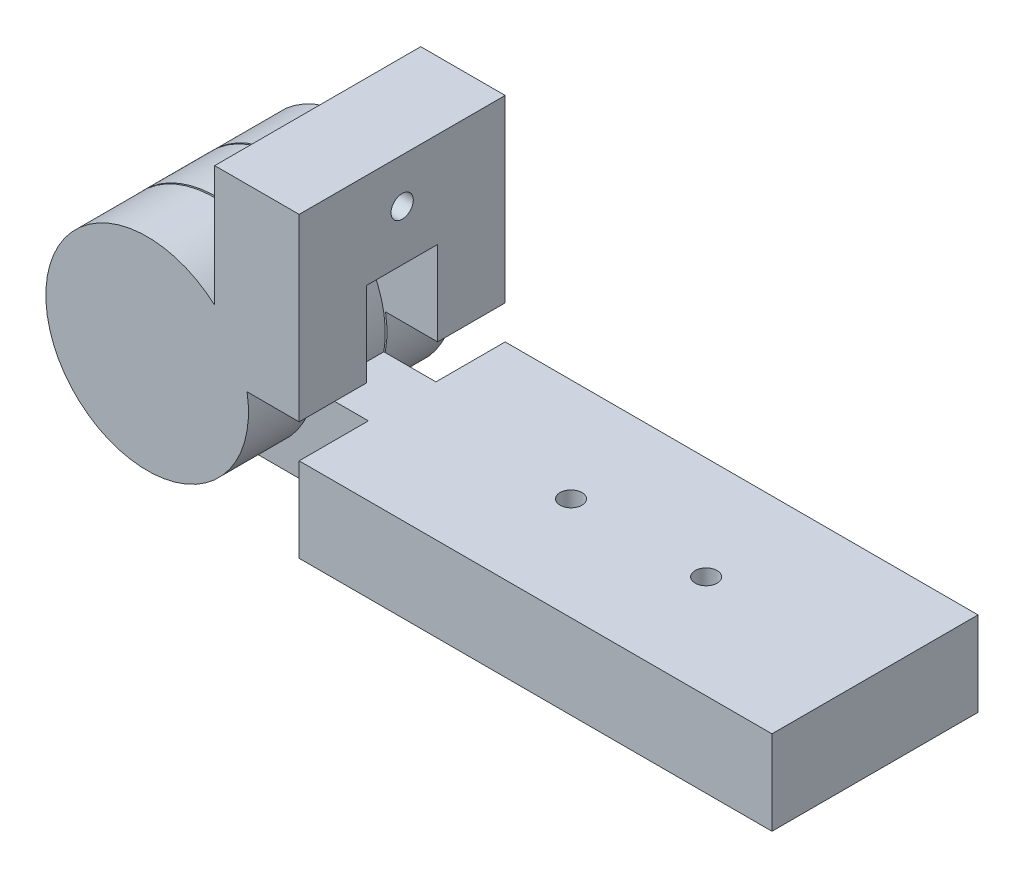
ISO-10303-21;
HEADER;
FILE_DESCRIPTION(('STEP AP214'),'2;1');
FILE_NAME('part.step','',(''),(''),'','','');
FILE_SCHEMA(('AUTOMOTIVE_DESIGN { 1 0 10303 214 1 1 1 1 }'));
ENDSEC;
DATA;
#1=APPLICATION_CONTEXT('core data for automotive mechanical design processes');
#2=APPLICATION_PROTOCOL_DEFINITION('international standard','automotive_design',2000,#1);
#3=PRODUCT_CONTEXT('',#1,'mechanical');
#4=PRODUCT('Part','Part','',(#3));
#5=PRODUCT_RELATED_PRODUCT_CATEGORY('part','',(#4));
#6=PRODUCT_DEFINITION_FORMATION('','',#4);
#7=PRODUCT_DEFINITION_CONTEXT('part definition',#1,'design');
#8=PRODUCT_DEFINITION('design','',#6,#7);
#9=PRODUCT_DEFINITION_SHAPE('','',#8);
#10=(LENGTH_UNIT() NAMED_UNIT(*) SI_UNIT(.MILLI.,.METRE.));
#11=(NAMED_UNIT(*) PLANE_ANGLE_UNIT() SI_UNIT($,.RADIAN.));
#12=(NAMED_UNIT(*) SI_UNIT($,.STERADIAN.) SOLID_ANGLE_UNIT());
#13=UNCERTAINTY_MEASURE_WITH_UNIT(LENGTH_MEASURE(1.E-05),#10,'distance_accuracy_value','');
#14=(GEOMETRIC_REPRESENTATION_CONTEXT(3) GLOBAL_UNCERTAINTY_ASSIGNED_CONTEXT((#13)) GLOBAL_UNIT_ASSIGNED_CONTEXT((#10,
#11,#12)) REPRESENTATION_CONTEXT('',''));
#15=CARTESIAN_POINT('',(0.,0.,0.));
#16=DIRECTION('',(0.,0.,1.));
#17=DIRECTION('',(1.,0.,0.));
#18=AXIS2_PLACEMENT_3D('',#15,#16,#17);
#19=CARTESIAN_POINT('',(-73.025,-41.275,6.6675));
#20=DIRECTION('',(0.,0.,1.));
#21=DIRECTION('',(1.,0.,0.));
#22=AXIS2_PLACEMENT_3D('',#19,#20,#21);
#23=PLANE('',#22);
#24=CARTESIAN_POINT('',(-73.025,-41.275,6.6675));
#25=DIRECTION('',(0.,0.,1.));
#26=DIRECTION('',(1.,0.,0.));
#27=AXIS2_PLACEMENT_3D('',#24,#25,#26);
#28=CIRCLE('',#27,5.71499999999999);
#29=CARTESIAN_POINT('',(-67.31,-41.275,6.6675));
#30=VERTEX_POINT('',#29);
#31=EDGE_CURVE('E57',#30,#30,#28,.T.);
#32=ORIENTED_EDGE('',*,*,#31,.T.);
#33=EDGE_LOOP('',(#32));
#34=FACE_BOUND('',#33,.T.);
#35=DIRECTION('',(-1.,0.,0.));
#36=VECTOR('',#35,1.);
#37=CARTESIAN_POINT('',(-44.45,-22.2250000000001,6.6675));
#38=LINE('',#37,#36);
#39=CARTESIAN_POINT('',(-44.45,-22.2250000000001,6.6675));
#40=VERTEX_POINT('',#39);
#41=CARTESIAN_POINT('',(-60.325,-22.2250000000001,6.66750000000001));
#42=VERTEX_POINT('',#41);
#43=EDGE_CURVE('E202',#40,#42,#38,.T.);
#44=ORIENTED_EDGE('',*,*,#43,.F.);
#45=DIRECTION('',(0.,-1.,0.));
#46=VECTOR('',#45,1.);
#47=CARTESIAN_POINT('',(-44.45,-38.1,6.66750000000001));
#48=LINE('',#47,#46);
#49=CARTESIAN_POINT('',(-44.45,-38.1,6.66750000000001));
#50=VERTEX_POINT('',#49);
#51=EDGE_CURVE('E176',#40,#50,#48,.T.);
#52=ORIENTED_EDGE('',*,*,#51,.T.);
#53=DIRECTION('',(-1.,0.,0.));
#54=VECTOR('',#53,1.);
#55=CARTESIAN_POINT('',(-44.45,-38.1,6.66750000000001));
#56=LINE('',#55,#54);
#57=CARTESIAN_POINT('',(-54.2414466886587,-38.1,6.6675));
#58=VERTEX_POINT('',#57);
#59=EDGE_CURVE('E172',#50,#58,#56,.T.);
#60=ORIENTED_EDGE('',*,*,#59,.T.);
#61=CARTESIAN_POINT('',(-73.025,-41.275,6.6675));
#62=DIRECTION('',(0.,0.,1.));
#63=DIRECTION('',(1.,0.,0.));
#64=AXIS2_PLACEMENT_3D('',#61,#62,#63);
#65=CIRCLE('',#64,19.05);
#66=CARTESIAN_POINT('',(-60.325,-27.0759683428763,6.66750000000001));
#67=VERTEX_POINT('',#66);
#68=EDGE_CURVE('E189',#67,#58,#65,.T.);
#69=ORIENTED_EDGE('',*,*,#68,.F.);
#70=DIRECTION('',(0.,1.,0.));
#71=VECTOR('',#70,1.);
#72=CARTESIAN_POINT('',(-60.325,38.1,6.66750000000001));
#73=LINE('',#72,#71);
#74=EDGE_CURVE('E71',#67,#42,#73,.T.);
#75=ORIENTED_EDGE('',*,*,#74,.T.);
#76=EDGE_LOOP('',(#44,#52,#60,#69,#75));
#77=FACE_BOUND('',#76,.T.);
#78=ADVANCED_FACE('F49',(#34,#77),#23,.F.);
#79=CARTESIAN_POINT('',(-73.025,-41.275,-6.6675));
#80=DIRECTION('',(0.,0.,-1.));
#81=DIRECTION('',(1.,0.,0.));
#82=AXIS2_PLACEMENT_3D('',#79,#80,#81);
#83=PLANE('',#82);
#84=CARTESIAN_POINT('',(-73.025,-41.275,-6.6675));
#85=DIRECTION('',(0.,0.,-1.));
#86=DIRECTION('',(-1.,0.,0.));
#87=AXIS2_PLACEMENT_3D('',#84,#85,#86);
#88=CIRCLE('',#87,5.71499999999999);
#89=CARTESIAN_POINT('',(-78.74,-41.275,-6.6675));
#90=VERTEX_POINT('',#89);
#91=EDGE_CURVE('E163',#90,#90,#88,.F.);
#92=ORIENTED_EDGE('',*,*,#91,.F.);
#93=EDGE_LOOP('',(#92));
#94=FACE_BOUND('',#93,.T.);
#95=DIRECTION('',(-1.,0.,0.));
#96=VECTOR('',#95,1.);
#97=CARTESIAN_POINT('',(-44.45,-22.2250000000001,-6.6675));
#98=LINE('',#97,#96);
#99=CARTESIAN_POINT('',(-44.45,-22.2250000000001,-6.66750000000001));
#100=VERTEX_POINT('',#99);
#101=CARTESIAN_POINT('',(-60.325,-22.2250000000001,-6.6675));
#102=VERTEX_POINT('',#101);
#103=EDGE_CURVE('E152',#100,#102,#98,.T.);
#104=ORIENTED_EDGE('',*,*,#103,.T.);
#105=DIRECTION('',(0.,1.,0.));
#106=VECTOR('',#105,1.);
#107=CARTESIAN_POINT('',(-60.325,38.1,-6.66750000000001));
#108=LINE('',#107,#106);
#109=CARTESIAN_POINT('',(-60.325,-27.0759683428763,-6.6675));
#110=VERTEX_POINT('',#109);
#111=EDGE_CURVE('E158',#110,#102,#108,.T.);
#112=ORIENTED_EDGE('',*,*,#111,.F.);
#113=CARTESIAN_POINT('',(-73.025,-41.275,-6.6675));
#114=DIRECTION('',(0.,0.,1.));
#115=DIRECTION('',(1.,0.,0.));
#116=AXIS2_PLACEMENT_3D('',#113,#114,#115);
#117=CIRCLE('',#116,19.05);
#118=CARTESIAN_POINT('',(-54.2414466886587,-38.1,-6.66750000000001));
#119=VERTEX_POINT('',#118);
#120=EDGE_CURVE('E164',#110,#119,#117,.T.);
#121=ORIENTED_EDGE('',*,*,#120,.T.);
#122=DIRECTION('',(-1.,0.,0.));
#123=VECTOR('',#122,1.);
#124=CARTESIAN_POINT('',(-44.45,-38.1,-6.66750000000001));
#125=LINE('',#124,#123);
#126=CARTESIAN_POINT('',(-44.45,-38.1,-6.66750000000001));
#127=VERTEX_POINT('',#126);
#128=EDGE_CURVE('E167',#127,#119,#125,.T.);
#129=ORIENTED_EDGE('',*,*,#128,.F.);
#130=DIRECTION('',(0.,-1.,0.));
#131=VECTOR('',#130,1.);
#132=CARTESIAN_POINT('',(-44.45,-38.1,-6.66750000000001));
#133=LINE('',#132,#131);
#134=EDGE_CURVE('E219',#100,#127,#133,.T.);
#135=ORIENTED_EDGE('',*,*,#134,.F.);
#136=EDGE_LOOP('',(#104,#112,#121,#129,#135));
#137=FACE_BOUND('',#136,.T.);
#138=ADVANCED_FACE('F231',(#94,#137),#83,.F.);
#139=CARTESIAN_POINT('',(-73.025,-41.275,-19.3675));
#140=DIRECTION('',(0.,0.,1.));
#141=DIRECTION('',(1.,0.,0.));
#142=AXIS2_PLACEMENT_3D('',#139,#140,#141);
#143=CYLINDRICAL_SURFACE('',#142,19.05);
#144=ORIENTED_EDGE('',*,*,#120,.F.);
#145=DIRECTION('',(0.,0.,-1.));
#146=VECTOR('',#145,1.);
#147=CARTESIAN_POINT('',(-60.325,-27.0759683428763,84.5035817680336));
#148=LINE('',#147,#146);
#149=CARTESIAN_POINT('',(-60.325,-27.0759683428763,-19.3675));
#150=VERTEX_POINT('',#149);
#151=EDGE_CURVE('E159',#110,#150,#148,.T.);
#152=ORIENTED_EDGE('',*,*,#151,.T.);
#153=CARTESIAN_POINT('',(-73.025,-41.275,-19.3675));
#154=DIRECTION('',(0.,0.,1.));
#155=DIRECTION('',(1.,0.,0.));
#156=AXIS2_PLACEMENT_3D('',#153,#154,#155);
#157=CIRCLE('',#156,19.05);
#158=CARTESIAN_POINT('',(-54.2414466886587,-38.1,-19.3675));
#159=VERTEX_POINT('',#158);
#160=EDGE_CURVE('E145',#150,#159,#157,.T.);
#161=ORIENTED_EDGE('',*,*,#160,.T.);
#162=DIRECTION('',(0.,0.,-1.));
#163=VECTOR('',#162,1.);
#164=CARTESIAN_POINT('',(-54.2414466886587,-38.1,84.5035817680336));
#165=LINE('',#164,#163);
#166=EDGE_CURVE('E149',#119,#159,#165,.T.);
#167=ORIENTED_EDGE('',*,*,#166,.F.);
#168=EDGE_LOOP('',(#144,#152,#161,#167));
#169=FACE_BOUND('',#168,.T.);
#170=ADVANCED_FACE('F229',(#169),#143,.T.);
#171=CARTESIAN_POINT('',(-73.025,-41.275,-6.6675));
#172=DIRECTION('',(0.,0.,1.));
#173=DIRECTION('',(1.,0.,0.));
#174=AXIS2_PLACEMENT_3D('',#171,#172,#173);
#175=CYLINDRICAL_SURFACE('',#174,5.71499999999999);
#176=ORIENTED_EDGE('',*,*,#91,.T.);
#177=EDGE_LOOP('',(#176));
#178=FACE_BOUND('',#177,.T.);
#179=ORIENTED_EDGE('',*,*,#31,.F.);
#180=EDGE_LOOP('',(#179));
#181=FACE_BOUND('',#180,.T.);
#182=ADVANCED_FACE('F51',(#178,#181),#175,.T.);
#183=CARTESIAN_POINT('',(-73.025,-41.275,19.3675));
#184=DIRECTION('',(0.,0.,-1.));
#185=DIRECTION('',(-1.,0.,0.));
#186=AXIS2_PLACEMENT_3D('',#183,#184,#185);
#187=CYLINDRICAL_SURFACE('',#186,19.05);
#188=ORIENTED_EDGE('',*,*,#68,.T.);
#189=DIRECTION('',(0.,0.,1.));
#190=VECTOR('',#189,1.);
#191=CARTESIAN_POINT('',(-54.2414466886587,-38.1,-71.1685817680336));
#192=LINE('',#191,#190);
#193=CARTESIAN_POINT('',(-54.2414466886587,-38.1,19.3675));
#194=VERTEX_POINT('',#193);
#195=EDGE_CURVE('E173',#58,#194,#192,.T.);
#196=ORIENTED_EDGE('',*,*,#195,.T.);
#197=CARTESIAN_POINT('',(-73.025,-41.275,19.3675));
#198=DIRECTION('',(0.,0.,1.));
#199=DIRECTION('',(1.,0.,0.));
#200=AXIS2_PLACEMENT_3D('',#197,#198,#199);
#201=CIRCLE('',#200,19.05);
#202=CARTESIAN_POINT('',(-60.325,-27.0759683428763,19.3675));
#203=VERTEX_POINT('',#202);
#204=EDGE_CURVE('E190',#203,#194,#201,.T.);
#205=ORIENTED_EDGE('',*,*,#204,.F.);
#206=DIRECTION('',(0.,0.,1.));
#207=VECTOR('',#206,1.);
#208=CARTESIAN_POINT('',(-60.325,-27.0759683428763,-71.1685817680336));
#209=LINE('',#208,#207);
#210=EDGE_CURVE('E185',#67,#203,#209,.T.);
#211=ORIENTED_EDGE('',*,*,#210,.F.);
#212=EDGE_LOOP('',(#188,#196,#205,#211));
#213=FACE_BOUND('',#212,.T.);
#214=ADVANCED_FACE('F250',(#213),#187,.T.);
#215=CARTESIAN_POINT('',(-73.025,-41.275,19.3675));
#216=DIRECTION('',(0.,0.,1.));
#217=DIRECTION('',(1.,0.,0.));
#218=AXIS2_PLACEMENT_3D('',#215,#216,#217);
#219=PLANE('',#218);
#220=DIRECTION('',(-1.,0.,0.));
#221=VECTOR('',#220,1.);
#222=CARTESIAN_POINT('',(44.45,-4.31799999999998,19.3675));
#223=LINE('',#222,#221);
#224=CARTESIAN_POINT('',(-44.45,-4.31799999999999,19.3675));
#225=VERTEX_POINT('',#224);
#226=CARTESIAN_POINT('',(-60.325,-4.31799999999999,19.3675));
#227=VERTEX_POINT('',#226);
#228=EDGE_CURVE('E139',#225,#227,#223,.T.);
#229=ORIENTED_EDGE('',*,*,#228,.T.);
#230=DIRECTION('',(0.,-1.,0.));
#231=VECTOR('',#230,1.);
#232=CARTESIAN_POINT('',(-60.325,38.1,19.3675));
#233=LINE('',#232,#231);
#234=EDGE_CURVE('E138',#227,#203,#233,.T.);
#235=ORIENTED_EDGE('',*,*,#234,.T.);
#236=ORIENTED_EDGE('',*,*,#204,.T.);
#237=DIRECTION('',(1.,0.,0.));
#238=VECTOR('',#237,1.);
#239=CARTESIAN_POINT('',(-44.45,-38.1,19.3675));
#240=LINE('',#239,#238);
#241=CARTESIAN_POINT('',(-44.45,-38.1,19.3675));
#242=VERTEX_POINT('',#241);
#243=EDGE_CURVE('E170',#194,#242,#240,.T.);
#244=ORIENTED_EDGE('',*,*,#243,.T.);
#245=DIRECTION('',(0.,1.,0.));
#246=VECTOR('',#245,1.);
#247=CARTESIAN_POINT('',(-44.45,-38.1,19.3675));
#248=LINE('',#247,#246);
#249=EDGE_CURVE('E179',#242,#225,#248,.T.);
#250=ORIENTED_EDGE('',*,*,#249,.T.);
#251=EDGE_LOOP('',(#229,#235,#236,#244,#250));
#252=FACE_BOUND('',#251,.T.);
#253=ADVANCED_FACE('F246',(#252),#219,.T.);
#254=CARTESIAN_POINT('',(-44.45,-38.1,-71.1685817680336));
#255=DIRECTION('',(0.,-1.,0.));
#256=DIRECTION('',(0.,0.,-1.));
#257=AXIS2_PLACEMENT_3D('',#254,#255,#256);
#258=PLANE('',#257);
#259=ORIENTED_EDGE('',*,*,#59,.F.);
#260=DIRECTION('',(0.,0.,1.));
#261=VECTOR('',#260,1.);
#262=CARTESIAN_POINT('',(-44.45,-38.1,-71.1685817680336));
#263=LINE('',#262,#261);
#264=EDGE_CURVE('E183',#50,#242,#263,.T.);
#265=ORIENTED_EDGE('',*,*,#264,.T.);
#266=ORIENTED_EDGE('',*,*,#243,.F.);
#267=ORIENTED_EDGE('',*,*,#195,.F.);
#268=EDGE_LOOP('',(#259,#265,#266,#267));
#269=FACE_BOUND('',#268,.T.);
#270=ADVANCED_FACE('F240',(#269),#258,.T.);
#271=CARTESIAN_POINT('',(-60.325,38.1,-71.1685817680336));
#272=DIRECTION('',(-1.,0.,0.));
#273=DIRECTION('',(0.,-1.,0.));
#274=AXIS2_PLACEMENT_3D('',#271,#272,#273);
#275=PLANE('',#274);
#276=DIRECTION('',(0.,0.,1.));
#277=VECTOR('',#276,1.);
#278=CARTESIAN_POINT('',(-60.325,-4.31799999999999,-19.3675));
#279=LINE('',#278,#277);
#280=CARTESIAN_POINT('',(-60.325,-4.31799999999999,-19.3675));
#281=VERTEX_POINT('',#280);
#282=EDGE_CURVE('E125',#281,#227,#279,.T.);
#283=ORIENTED_EDGE('',*,*,#282,.F.);
#284=DIRECTION('',(0.,-1.,0.));
#285=VECTOR('',#284,1.);
#286=CARTESIAN_POINT('',(-60.325,38.1,-19.3675));
#287=LINE('',#286,#285);
#288=EDGE_CURVE('E135',#281,#150,#287,.T.);
#289=ORIENTED_EDGE('',*,*,#288,.T.);
#290=ORIENTED_EDGE('',*,*,#151,.F.);
#291=ORIENTED_EDGE('',*,*,#111,.T.);
#292=DIRECTION('',(0.,0.,1.));
#293=VECTOR('',#292,1.);
#294=CARTESIAN_POINT('',(-60.325,-22.2250000000001,-69.0463525864335));
#295=LINE('',#294,#293);
#296=EDGE_CURVE('E213',#102,#42,#295,.T.);
#297=ORIENTED_EDGE('',*,*,#296,.T.);
#298=ORIENTED_EDGE('',*,*,#74,.F.);
#299=ORIENTED_EDGE('',*,*,#210,.T.);
#300=ORIENTED_EDGE('',*,*,#234,.F.);
#301=EDGE_LOOP('',(#283,#289,#290,#291,#297,#298,#299,#300));
#302=FACE_BOUND('',#301,.T.);
#303=CARTESIAN_POINT('',(-60.325,-12.7,0.));
#304=DIRECTION('',(-1.,0.,0.));
#305=DIRECTION('',(0.,-1.,0.));
#306=AXIS2_PLACEMENT_3D('',#303,#304,#305);
#307=CIRCLE('',#306,2.0955);
#308=CARTESIAN_POINT('',(-60.325,-14.7955,0.));
#309=VERTEX_POINT('',#308);
#310=EDGE_CURVE('E198',#309,#309,#307,.T.);
#311=ORIENTED_EDGE('',*,*,#310,.F.);
#312=EDGE_LOOP('',(#311));
#313=FACE_BOUND('',#312,.T.);
#314=ADVANCED_FACE('F133',(#302,#313),#275,.T.);
#315=CARTESIAN_POINT('',(-44.45,-38.1,-71.1685817680336));
#316=DIRECTION('',(1.,0.,0.));
#317=DIRECTION('',(0.,1.,0.));
#318=AXIS2_PLACEMENT_3D('',#315,#316,#317);
#319=PLANE('',#318);
#320=DIRECTION('',(0.,0.,-1.));
#321=VECTOR('',#320,1.);
#322=CARTESIAN_POINT('',(-44.45,-4.31799999999999,-71.1685817680336));
#323=LINE('',#322,#321);
#324=CARTESIAN_POINT('',(-44.45,-4.318,-19.3675));
#325=VERTEX_POINT('',#324);
#326=EDGE_CURVE('E63',#225,#325,#323,.T.);
#327=ORIENTED_EDGE('',*,*,#326,.F.);
#328=ORIENTED_EDGE('',*,*,#249,.F.);
#329=ORIENTED_EDGE('',*,*,#264,.F.);
#330=ORIENTED_EDGE('',*,*,#51,.F.);
#331=DIRECTION('',(0.,0.,1.));
#332=VECTOR('',#331,1.);
#333=CARTESIAN_POINT('',(-44.45,-22.2250000000001,-69.0463525864335));
#334=LINE('',#333,#332);
#335=EDGE_CURVE('E197',#100,#40,#334,.T.);
#336=ORIENTED_EDGE('',*,*,#335,.F.);
#337=ORIENTED_EDGE('',*,*,#134,.T.);
#338=DIRECTION('',(0.,0.,-1.));
#339=VECTOR('',#338,1.);
#340=CARTESIAN_POINT('',(-44.45,-38.1,84.5035817680336));
#341=LINE('',#340,#339);
#342=CARTESIAN_POINT('',(-44.45,-38.1,-19.3675));
#343=VERTEX_POINT('',#342);
#344=EDGE_CURVE('E156',#127,#343,#341,.T.);
#345=ORIENTED_EDGE('',*,*,#344,.T.);
#346=DIRECTION('',(0.,1.,0.));
#347=VECTOR('',#346,1.);
#348=CARTESIAN_POINT('',(-44.45,-38.1,-19.3675));
#349=LINE('',#348,#347);
#350=EDGE_CURVE('E146',#343,#325,#349,.T.);
#351=ORIENTED_EDGE('',*,*,#350,.T.);
#352=EDGE_LOOP('',(#327,#328,#329,#330,#336,#337,#345,#351));
#353=FACE_BOUND('',#352,.T.);
#354=CARTESIAN_POINT('',(-44.45,-12.7,0.));
#355=DIRECTION('',(1.,0.,0.));
#356=DIRECTION('',(0.,1.,0.));
#357=AXIS2_PLACEMENT_3D('',#354,#355,#356);
#358=CIRCLE('',#357,2.0955);
#359=CARTESIAN_POINT('',(-44.45,-10.6045,0.));
#360=VERTEX_POINT('',#359);
#361=EDGE_CURVE('E195',#360,#360,#358,.T.);
#362=ORIENTED_EDGE('',*,*,#361,.F.);
#363=EDGE_LOOP('',(#362));
#364=FACE_BOUND('',#363,.T.);
#365=ADVANCED_FACE('F243',(#353,#364),#319,.T.);
#366=CARTESIAN_POINT('',(-73.025,-41.275,-19.3675));
#367=DIRECTION('',(0.,0.,-1.));
#368=DIRECTION('',(1.,0.,0.));
#369=AXIS2_PLACEMENT_3D('',#366,#367,#368);
#370=PLANE('',#369);
#371=DIRECTION('',(-1.,0.,0.));
#372=VECTOR('',#371,1.);
#373=CARTESIAN_POINT('',(-73.025,-4.318,-19.3675));
#374=LINE('',#373,#372);
#375=EDGE_CURVE('E12',#325,#281,#374,.T.);
#376=ORIENTED_EDGE('',*,*,#375,.F.);
#377=ORIENTED_EDGE('',*,*,#350,.F.);
#378=DIRECTION('',(1.,0.,0.));
#379=VECTOR('',#378,1.);
#380=CARTESIAN_POINT('',(-44.45,-38.1,-19.3675));
#381=LINE('',#380,#379);
#382=EDGE_CURVE('E147',#159,#343,#381,.T.);
#383=ORIENTED_EDGE('',*,*,#382,.F.);
#384=ORIENTED_EDGE('',*,*,#160,.F.);
#385=ORIENTED_EDGE('',*,*,#288,.F.);
#386=EDGE_LOOP('',(#376,#377,#383,#384,#385));
#387=FACE_BOUND('',#386,.T.);
#388=ADVANCED_FACE('F142',(#387),#370,.T.);
#389=CARTESIAN_POINT('',(-44.45,-38.1,84.5035817680336));
#390=DIRECTION('',(0.,1.,0.));
#391=DIRECTION('',(0.,0.,1.));
#392=AXIS2_PLACEMENT_3D('',#389,#390,#391);
#393=PLANE('',#392);
#394=ORIENTED_EDGE('',*,*,#344,.F.);
#395=ORIENTED_EDGE('',*,*,#128,.T.);
#396=ORIENTED_EDGE('',*,*,#166,.T.);
#397=ORIENTED_EDGE('',*,*,#382,.T.);
#398=EDGE_LOOP('',(#394,#395,#396,#397));
#399=FACE_BOUND('',#398,.T.);
#400=ADVANCED_FACE('F224',(#399),#393,.F.);
#401=CARTESIAN_POINT('',(-44.45,-22.2250000000001,-69.0463525864335));
#402=DIRECTION('',(0.,1.,0.));
#403=DIRECTION('',(0.,0.,1.));
#404=AXIS2_PLACEMENT_3D('',#401,#402,#403);
#405=PLANE('',#404);
#406=ORIENTED_EDGE('',*,*,#103,.F.);
#407=ORIENTED_EDGE('',*,*,#335,.T.);
#408=ORIENTED_EDGE('',*,*,#43,.T.);
#409=ORIENTED_EDGE('',*,*,#296,.F.);
#410=EDGE_LOOP('',(#406,#407,#408,#409));
#411=FACE_BOUND('',#410,.T.);
#412=ADVANCED_FACE('F234',(#411),#405,.F.);
#413=CARTESIAN_POINT('',(44.45,-12.7,0.));
#414=DIRECTION('',(-1.,0.,0.));
#415=DIRECTION('',(0.,-1.,0.));
#416=AXIS2_PLACEMENT_3D('',#413,#414,#415);
#417=CYLINDRICAL_SURFACE('',#416,2.0955);
#418=ORIENTED_EDGE('',*,*,#361,.T.);
#419=EDGE_LOOP('',(#418));
#420=FACE_BOUND('',#419,.T.);
#421=ORIENTED_EDGE('',*,*,#310,.T.);
#422=EDGE_LOOP('',(#421));
#423=FACE_BOUND('',#422,.T.);
#424=ADVANCED_FACE('F281',(#420,#423),#417,.F.);
#425=CARTESIAN_POINT('',(44.45,-4.31799999999998,-19.3675));
#426=DIRECTION('',(0.,-1.,0.));
#427=DIRECTION('',(1.,0.,0.));
#428=AXIS2_PLACEMENT_3D('',#425,#426,#427);
#429=PLANE('',#428);
#430=ORIENTED_EDGE('',*,*,#326,.T.);
#431=ORIENTED_EDGE('',*,*,#375,.T.);
#432=ORIENTED_EDGE('',*,*,#282,.T.);
#433=ORIENTED_EDGE('',*,*,#228,.F.);
#434=EDGE_LOOP('',(#430,#431,#432,#433));
#435=FACE_BOUND('',#434,.T.);
#436=ADVANCED_FACE('F124',(#435),#429,.F.);
#437=CLOSED_SHELL('',(#78,#138,#170,#182,#214,#253,#270,#314,#365,#388,#400,#412,#424,#436));
#438=MANIFOLD_SOLID_BREP('B2',#437);
#439=CARTESIAN_POINT('',(-73.025,-41.275,6.35));
#440=DIRECTION('',(0.,0.,1.));
#441=DIRECTION('',(1.,0.,0.));
#442=AXIS2_PLACEMENT_3D('',#439,#440,#441);
#443=PLANE('',#442);
#444=CARTESIAN_POINT('',(-73.025,-41.275,6.35));
#445=DIRECTION('',(0.,0.,1.));
#446=DIRECTION('',(1.,0.,0.));
#447=AXIS2_PLACEMENT_3D('',#444,#445,#446);
#448=CIRCLE('',#447,6.35);
#449=CARTESIAN_POINT('',(-66.675,-41.275,6.35));
#450=VERTEX_POINT('',#449);
#451=EDGE_CURVE('E519',#450,#450,#448,.T.);
#452=ORIENTED_EDGE('',*,*,#451,.F.);
#453=EDGE_LOOP('',(#452));
#454=FACE_BOUND('',#453,.T.);
#455=DIRECTION('',(1.,0.,0.));
#456=VECTOR('',#455,1.);
#457=CARTESIAN_POINT('',(44.45,-60.325,6.35));
#458=LINE('',#457,#456);
#459=CARTESIAN_POINT('',(-73.025,-60.3250000000001,6.35));
#460=VERTEX_POINT('',#459);
#461=CARTESIAN_POINT('',(-44.45,-60.325,6.35));
#462=VERTEX_POINT('',#461);
#463=EDGE_CURVE('E523',#460,#462,#458,.T.);
#464=ORIENTED_EDGE('',*,*,#463,.T.);
#465=DIRECTION('',(0.,1.,0.));
#466=VECTOR('',#465,1.);
#467=CARTESIAN_POINT('',(-44.45,-41.275,6.35));
#468=LINE('',#467,#466);
#469=CARTESIAN_POINT('',(-44.45,-44.45,6.35));
#470=VERTEX_POINT('',#469);
#471=EDGE_CURVE('E416',#462,#470,#468,.T.);
#472=ORIENTED_EDGE('',*,*,#471,.T.);
#473=DIRECTION('',(-1.,0.,0.));
#474=VECTOR('',#473,1.);
#475=CARTESIAN_POINT('',(-54.2414466886587,-44.45,6.35));
#476=LINE('',#475,#474);
#477=CARTESIAN_POINT('',(-54.2414466886587,-44.45,6.35));
#478=VERTEX_POINT('',#477);
#479=EDGE_CURVE('E530',#470,#478,#476,.T.);
#480=ORIENTED_EDGE('',*,*,#479,.T.);
#481=CARTESIAN_POINT('',(-73.025,-41.275,6.35));
#482=DIRECTION('',(0.,0.,1.));
#483=DIRECTION('',(1.,0.,0.));
#484=AXIS2_PLACEMENT_3D('',#481,#482,#483);
#485=CIRCLE('',#484,19.05);
#486=EDGE_CURVE('E47',#478,#460,#485,.T.);
#487=ORIENTED_EDGE('',*,*,#486,.T.);
#488=EDGE_LOOP('',(#464,#472,#480,#487));
#489=FACE_BOUND('',#488,.T.);
#490=ADVANCED_FACE('F401',(#454,#489),#443,.T.);
#491=CARTESIAN_POINT('',(-73.025,-41.275,-6.35));
#492=DIRECTION('',(0.,0.,1.));
#493=DIRECTION('',(1.,0.,0.));
#494=AXIS2_PLACEMENT_3D('',#491,#492,#493);
#495=PLANE('',#494);
#496=CARTESIAN_POINT('',(-73.025,-41.275,-6.35));
#497=DIRECTION('',(0.,0.,1.));
#498=DIRECTION('',(1.,0.,0.));
#499=AXIS2_PLACEMENT_3D('',#496,#497,#498);
#500=CIRCLE('',#499,6.35);
#501=CARTESIAN_POINT('',(-66.675,-41.275,-6.35));
#502=VERTEX_POINT('',#501);
#503=EDGE_CURVE('E520',#502,#502,#500,.T.);
#504=ORIENTED_EDGE('',*,*,#503,.T.);
#505=EDGE_LOOP('',(#504));
#506=FACE_BOUND('',#505,.T.);
#507=DIRECTION('',(0.,1.,0.));
#508=VECTOR('',#507,1.);
#509=CARTESIAN_POINT('',(-44.45,-41.275,-6.35));
#510=LINE('',#509,#508);
#511=CARTESIAN_POINT('',(-44.45,-60.325,-6.34999999999999));
#512=VERTEX_POINT('',#511);
#513=CARTESIAN_POINT('',(-44.45,-44.45,-6.34999999999999));
#514=VERTEX_POINT('',#513);
#515=EDGE_CURVE('E472',#512,#514,#510,.T.);
#516=ORIENTED_EDGE('',*,*,#515,.F.);
#517=DIRECTION('',(-1.,0.,0.));
#518=VECTOR('',#517,1.);
#519=CARTESIAN_POINT('',(44.45,-60.325,-6.34999999999999));
#520=LINE('',#519,#518);
#521=CARTESIAN_POINT('',(-73.025,-60.3250000000001,-6.35));
#522=VERTEX_POINT('',#521);
#523=EDGE_CURVE('E527',#512,#522,#520,.T.);
#524=ORIENTED_EDGE('',*,*,#523,.T.);
#525=CARTESIAN_POINT('',(-73.025,-41.275,-6.35));
#526=DIRECTION('',(0.,0.,1.));
#527=DIRECTION('',(1.,0.,0.));
#528=AXIS2_PLACEMENT_3D('',#525,#526,#527);
#529=CIRCLE('',#528,19.05);
#530=CARTESIAN_POINT('',(-54.2414466886587,-44.45,-6.34999999999999));
#531=VERTEX_POINT('',#530);
#532=EDGE_CURVE('E405',#531,#522,#529,.T.);
#533=ORIENTED_EDGE('',*,*,#532,.F.);
#534=DIRECTION('',(1.,0.,0.));
#535=VECTOR('',#534,1.);
#536=CARTESIAN_POINT('',(-54.2414466886587,-44.45,-6.34999999999999));
#537=LINE('',#536,#535);
#538=EDGE_CURVE('E424',#531,#514,#537,.T.);
#539=ORIENTED_EDGE('',*,*,#538,.T.);
#540=EDGE_LOOP('',(#516,#524,#533,#539));
#541=FACE_BOUND('',#540,.T.);
#542=ADVANCED_FACE('F568',(#506,#541),#495,.F.);
#543=CARTESIAN_POINT('',(-73.025,-41.275,6.35));
#544=DIRECTION('',(0.,0.,-1.));
#545=DIRECTION('',(-1.,0.,0.));
#546=AXIS2_PLACEMENT_3D('',#543,#544,#545);
#547=CYLINDRICAL_SURFACE('',#546,19.05);
#548=ORIENTED_EDGE('',*,*,#486,.F.);
#549=DIRECTION('',(0.,0.,1.));
#550=VECTOR('',#549,1.);
#551=CARTESIAN_POINT('',(-54.2414466886587,-44.45,-124.892782361475));
#552=LINE('',#551,#550);
#553=EDGE_CURVE('E528',#531,#478,#552,.T.);
#554=ORIENTED_EDGE('',*,*,#553,.F.);
#555=ORIENTED_EDGE('',*,*,#532,.T.);
#556=DIRECTION('',(0.,0.,1.));
#557=VECTOR('',#556,1.);
#558=CARTESIAN_POINT('',(-73.025,-60.3250000000001,-124.892782361475));
#559=LINE('',#558,#557);
#560=EDGE_CURVE('E532',#522,#460,#559,.T.);
#561=ORIENTED_EDGE('',*,*,#560,.T.);
#562=EDGE_LOOP('',(#548,#554,#555,#561));
#563=FACE_BOUND('',#562,.T.);
#564=ADVANCED_FACE('F403',(#563),#547,.T.);
#565=CARTESIAN_POINT('',(-54.2414466886587,-44.45,-124.892782361475));
#566=DIRECTION('',(0.,1.,0.));
#567=DIRECTION('',(-1.,0.,0.));
#568=AXIS2_PLACEMENT_3D('',#565,#566,#567);
#569=PLANE('',#568);
#570=CARTESIAN_POINT('',(12.7,-44.45,0.));
#571=DIRECTION('',(0.,1.,0.));
#572=DIRECTION('',(-1.,0.,0.));
#573=AXIS2_PLACEMENT_3D('',#570,#571,#572);
#574=CIRCLE('',#573,2.06375);
#575=CARTESIAN_POINT('',(10.63625,-44.45,0.));
#576=VERTEX_POINT('',#575);
#577=EDGE_CURVE('E605',#576,#576,#574,.T.);
#578=ORIENTED_EDGE('',*,*,#577,.F.);
#579=EDGE_LOOP('',(#578));
#580=FACE_BOUND('',#579,.T.);
#581=CARTESIAN_POINT('',(-12.7,-44.45,0.));
#582=DIRECTION('',(0.,1.,0.));
#583=DIRECTION('',(-1.,0.,0.));
#584=AXIS2_PLACEMENT_3D('',#581,#582,#583);
#585=CIRCLE('',#584,2.06375);
#586=CARTESIAN_POINT('',(-14.76375,-44.45,0.));
#587=VERTEX_POINT('',#586);
#588=EDGE_CURVE('E494',#587,#587,#585,.T.);
#589=ORIENTED_EDGE('',*,*,#588,.F.);
#590=EDGE_LOOP('',(#589));
#591=FACE_BOUND('',#590,.T.);
#592=DIRECTION('',(0.,0.,1.));
#593=VECTOR('',#592,1.);
#594=CARTESIAN_POINT('',(44.45,-44.45,-124.892782361475));
#595=LINE('',#594,#593);
#596=CARTESIAN_POINT('',(44.45,-44.45,-19.3675));
#597=VERTEX_POINT('',#596);
#598=CARTESIAN_POINT('',(44.45,-44.45,19.3675));
#599=VERTEX_POINT('',#598);
#600=EDGE_CURVE('E490',#597,#599,#595,.T.);
#601=ORIENTED_EDGE('',*,*,#600,.F.);
#602=DIRECTION('',(-1.,0.,0.));
#603=VECTOR('',#602,1.);
#604=CARTESIAN_POINT('',(44.45,-44.45,-19.3675));
#605=LINE('',#604,#603);
#606=CARTESIAN_POINT('',(-44.45,-44.45,-19.3675));
#607=VERTEX_POINT('',#606);
#608=EDGE_CURVE('E483',#597,#607,#605,.T.);
#609=ORIENTED_EDGE('',*,*,#608,.T.);
#610=DIRECTION('',(0.,0.,-1.));
#611=VECTOR('',#610,1.);
#612=CARTESIAN_POINT('',(-44.45,-44.45,109.673787848632));
#613=LINE('',#612,#611);
#614=EDGE_CURVE('E467',#514,#607,#613,.T.);
#615=ORIENTED_EDGE('',*,*,#614,.F.);
#616=ORIENTED_EDGE('',*,*,#538,.F.);
#617=ORIENTED_EDGE('',*,*,#553,.T.);
#618=ORIENTED_EDGE('',*,*,#479,.F.);
#619=CARTESIAN_POINT('',(-44.45,-44.45,19.3675));
#620=VERTEX_POINT('',#619);
#621=EDGE_CURVE('E475',#620,#470,#613,.T.);
#622=ORIENTED_EDGE('',*,*,#621,.F.);
#623=DIRECTION('',(-1.,0.,0.));
#624=VECTOR('',#623,1.);
#625=CARTESIAN_POINT('',(44.45,-44.45,19.3675));
#626=LINE('',#625,#624);
#627=EDGE_CURVE('E503',#599,#620,#626,.T.);
#628=ORIENTED_EDGE('',*,*,#627,.F.);
#629=EDGE_LOOP('',(#601,#609,#615,#616,#617,#618,#622,#628));
#630=FACE_BOUND('',#629,.T.);
#631=ADVANCED_FACE('F488',(#580,#591,#630),#569,.T.);
#632=CARTESIAN_POINT('',(44.45,-44.45,-124.892782361475));
#633=DIRECTION('',(1.,0.,0.));
#634=DIRECTION('',(0.,0.,-1.));
#635=AXIS2_PLACEMENT_3D('',#632,#633,#634);
#636=PLANE('',#635);
#637=DIRECTION('',(0.,0.,1.));
#638=VECTOR('',#637,1.);
#639=CARTESIAN_POINT('',(44.45,-60.325,-124.892782361475));
#640=LINE('',#639,#638);
#641=CARTESIAN_POINT('',(44.45,-60.325,-19.3675));
#642=VERTEX_POINT('',#641);
#643=CARTESIAN_POINT('',(44.45,-60.325,19.3675));
#644=VERTEX_POINT('',#643);
#645=EDGE_CURVE('E536',#642,#644,#640,.T.);
#646=ORIENTED_EDGE('',*,*,#645,.F.);
#647=DIRECTION('',(0.,1.,0.));
#648=VECTOR('',#647,1.);
#649=CARTESIAN_POINT('',(44.45,-60.325,-19.3675));
#650=LINE('',#649,#648);
#651=EDGE_CURVE('E476',#642,#597,#650,.T.);
#652=ORIENTED_EDGE('',*,*,#651,.T.);
#653=ORIENTED_EDGE('',*,*,#600,.T.);
#654=DIRECTION('',(0.,1.,0.));
#655=VECTOR('',#654,1.);
#656=CARTESIAN_POINT('',(44.45,-60.325,19.3675));
#657=LINE('',#656,#655);
#658=EDGE_CURVE('E506',#644,#599,#657,.T.);
#659=ORIENTED_EDGE('',*,*,#658,.F.);
#660=EDGE_LOOP('',(#646,#652,#653,#659));
#661=FACE_BOUND('',#660,.T.);
#662=ADVANCED_FACE('F555',(#661),#636,.T.);
#663=CARTESIAN_POINT('',(44.45,-60.325,-124.892782361475));
#664=DIRECTION('',(0.,-1.,0.));
#665=DIRECTION('',(1.,0.,0.));
#666=AXIS2_PLACEMENT_3D('',#663,#664,#665);
#667=PLANE('',#666);
#668=CARTESIAN_POINT('',(12.7,-60.3250000000001,0.));
#669=DIRECTION('',(0.,1.,0.));
#670=DIRECTION('',(-1.,0.,0.));
#671=AXIS2_PLACEMENT_3D('',#668,#669,#670);
#672=CIRCLE('',#671,2.06375);
#673=CARTESIAN_POINT('',(10.63625,-60.3250000000001,0.));
#674=VERTEX_POINT('',#673);
#675=EDGE_CURVE('E602',#674,#674,#672,.T.);
#676=ORIENTED_EDGE('',*,*,#675,.T.);
#677=EDGE_LOOP('',(#676));
#678=FACE_BOUND('',#677,.T.);
#679=CARTESIAN_POINT('',(-12.7,-60.3250000000001,0.));
#680=DIRECTION('',(0.,1.,0.));
#681=DIRECTION('',(-1.,0.,0.));
#682=AXIS2_PLACEMENT_3D('',#679,#680,#681);
#683=CIRCLE('',#682,2.06375);
#684=CARTESIAN_POINT('',(-14.76375,-60.3250000000001,0.));
#685=VERTEX_POINT('',#684);
#686=EDGE_CURVE('E491',#685,#685,#683,.T.);
#687=ORIENTED_EDGE('',*,*,#686,.T.);
#688=EDGE_LOOP('',(#687));
#689=FACE_BOUND('',#688,.T.);
#690=ORIENTED_EDGE('',*,*,#645,.T.);
#691=DIRECTION('',(1.,0.,0.));
#692=VECTOR('',#691,1.);
#693=CARTESIAN_POINT('',(44.45,-60.325,19.3675));
#694=LINE('',#693,#692);
#695=CARTESIAN_POINT('',(-44.45,-60.325,19.3675));
#696=VERTEX_POINT('',#695);
#697=EDGE_CURVE('E509',#696,#644,#694,.T.);
#698=ORIENTED_EDGE('',*,*,#697,.F.);
#699=DIRECTION('',(0.,0.,-1.));
#700=VECTOR('',#699,1.);
#701=CARTESIAN_POINT('',(-44.45,-60.325,109.673787848632));
#702=LINE('',#701,#700);
#703=EDGE_CURVE('E511',#696,#462,#702,.T.);
#704=ORIENTED_EDGE('',*,*,#703,.T.);
#705=ORIENTED_EDGE('',*,*,#463,.F.);
#706=ORIENTED_EDGE('',*,*,#560,.F.);
#707=ORIENTED_EDGE('',*,*,#523,.F.);
#708=CARTESIAN_POINT('',(-44.45,-60.325,-19.3675));
#709=VERTEX_POINT('',#708);
#710=EDGE_CURVE('E514',#512,#709,#702,.T.);
#711=ORIENTED_EDGE('',*,*,#710,.T.);
#712=DIRECTION('',(1.,0.,0.));
#713=VECTOR('',#712,1.);
#714=CARTESIAN_POINT('',(44.45,-60.325,-19.3675));
#715=LINE('',#714,#713);
#716=EDGE_CURVE('E486',#709,#642,#715,.T.);
#717=ORIENTED_EDGE('',*,*,#716,.T.);
#718=EDGE_LOOP('',(#690,#698,#704,#705,#706,#707,#711,#717));
#719=FACE_BOUND('',#718,.T.);
#720=ADVANCED_FACE('F546',(#678,#689,#719),#667,.T.);
#721=CARTESIAN_POINT('',(-73.025,-41.275,-6.35));
#722=DIRECTION('',(0.,0.,1.));
#723=DIRECTION('',(1.,0.,0.));
#724=AXIS2_PLACEMENT_3D('',#721,#722,#723);
#725=CYLINDRICAL_SURFACE('',#724,6.35);
#726=ORIENTED_EDGE('',*,*,#503,.F.);
#727=EDGE_LOOP('',(#726));
#728=FACE_BOUND('',#727,.T.);
#729=ORIENTED_EDGE('',*,*,#451,.T.);
#730=EDGE_LOOP('',(#729));
#731=FACE_BOUND('',#730,.T.);
#732=ADVANCED_FACE('F562',(#728,#731),#725,.F.);
#733=CARTESIAN_POINT('',(-73.025,-41.275,-19.3675));
#734=DIRECTION('',(0.,0.,-1.));
#735=DIRECTION('',(1.,0.,0.));
#736=AXIS2_PLACEMENT_3D('',#733,#734,#735);
#737=PLANE('',#736);
#738=ORIENTED_EDGE('',*,*,#651,.F.);
#739=ORIENTED_EDGE('',*,*,#716,.F.);
#740=DIRECTION('',(0.,-1.,0.));
#741=VECTOR('',#740,1.);
#742=CARTESIAN_POINT('',(-44.45,-60.325,-19.3675));
#743=LINE('',#742,#741);
#744=EDGE_CURVE('E471',#607,#709,#743,.T.);
#745=ORIENTED_EDGE('',*,*,#744,.F.);
#746=ORIENTED_EDGE('',*,*,#608,.F.);
#747=EDGE_LOOP('',(#738,#739,#745,#746));
#748=FACE_BOUND('',#747,.T.);
#749=ADVANCED_FACE('F482',(#748),#737,.T.);
#750=CARTESIAN_POINT('',(-44.45,-60.325,109.673787848632));
#751=DIRECTION('',(1.,0.,0.));
#752=DIRECTION('',(0.,1.,0.));
#753=AXIS2_PLACEMENT_3D('',#750,#751,#752);
#754=PLANE('',#753);
#755=ORIENTED_EDGE('',*,*,#710,.F.);
#756=ORIENTED_EDGE('',*,*,#515,.T.);
#757=ORIENTED_EDGE('',*,*,#614,.T.);
#758=ORIENTED_EDGE('',*,*,#744,.T.);
#759=EDGE_LOOP('',(#755,#756,#757,#758));
#760=FACE_BOUND('',#759,.T.);
#761=ADVANCED_FACE('F470',(#760),#754,.F.);
#762=ORIENTED_EDGE('',*,*,#471,.F.);
#763=ORIENTED_EDGE('',*,*,#703,.F.);
#764=DIRECTION('',(0.,-1.,0.));
#765=VECTOR('',#764,1.);
#766=CARTESIAN_POINT('',(-44.45,-60.325,19.3675));
#767=LINE('',#766,#765);
#768=EDGE_CURVE('E500',#620,#696,#767,.T.);
#769=ORIENTED_EDGE('',*,*,#768,.F.);
#770=ORIENTED_EDGE('',*,*,#621,.T.);
#771=EDGE_LOOP('',(#762,#763,#769,#770));
#772=FACE_BOUND('',#771,.T.);
#773=ADVANCED_FACE('F549',(#772),#754,.F.);
#774=CARTESIAN_POINT('',(-73.025,-41.275,19.3675));
#775=DIRECTION('',(0.,0.,1.));
#776=DIRECTION('',(1.,0.,0.));
#777=AXIS2_PLACEMENT_3D('',#774,#775,#776);
#778=PLANE('',#777);
#779=ORIENTED_EDGE('',*,*,#697,.T.);
#780=ORIENTED_EDGE('',*,*,#658,.T.);
#781=ORIENTED_EDGE('',*,*,#627,.T.);
#782=ORIENTED_EDGE('',*,*,#768,.T.);
#783=EDGE_LOOP('',(#779,#780,#781,#782));
#784=FACE_BOUND('',#783,.T.);
#785=ADVANCED_FACE('F552',(#784),#778,.T.);
#786=CARTESIAN_POINT('',(-12.7,-60.3250000000001,0.));
#787=DIRECTION('',(0.,1.,0.));
#788=DIRECTION('',(-1.,0.,0.));
#789=AXIS2_PLACEMENT_3D('',#786,#787,#788);
#790=CYLINDRICAL_SURFACE('',#789,2.06375);
#791=ORIENTED_EDGE('',*,*,#686,.F.);
#792=EDGE_LOOP('',(#791));
#793=FACE_BOUND('',#792,.T.);
#794=ORIENTED_EDGE('',*,*,#588,.T.);
#795=EDGE_LOOP('',(#794));
#796=FACE_BOUND('',#795,.T.);
#797=ADVANCED_FACE('F588',(#793,#796),#790,.F.);
#798=CARTESIAN_POINT('',(12.7,-60.3250000000001,0.));
#799=DIRECTION('',(0.,1.,0.));
#800=DIRECTION('',(-1.,0.,0.));
#801=AXIS2_PLACEMENT_3D('',#798,#799,#800);
#802=CYLINDRICAL_SURFACE('',#801,2.06375);
#803=ORIENTED_EDGE('',*,*,#675,.F.);
#804=EDGE_LOOP('',(#803));
#805=FACE_BOUND('',#804,.T.);
#806=ORIENTED_EDGE('',*,*,#577,.T.);
#807=EDGE_LOOP('',(#806));
#808=FACE_BOUND('',#807,.T.);
#809=ADVANCED_FACE('F593',(#805,#808),#802,.F.);
#810=CLOSED_SHELL('',(#490,#542,#564,#631,#662,#720,#732,#749,#761,#773,#785,#797,#809));
#811=MANIFOLD_SOLID_BREP('B6',#810);
#812=ADVANCED_BREP_SHAPE_REPRESENTATION('',(#18,#438,#811),#14);
#813=SHAPE_DEFINITION_REPRESENTATION(#9,#812);
ENDSEC;
END-ISO-10303-21;
